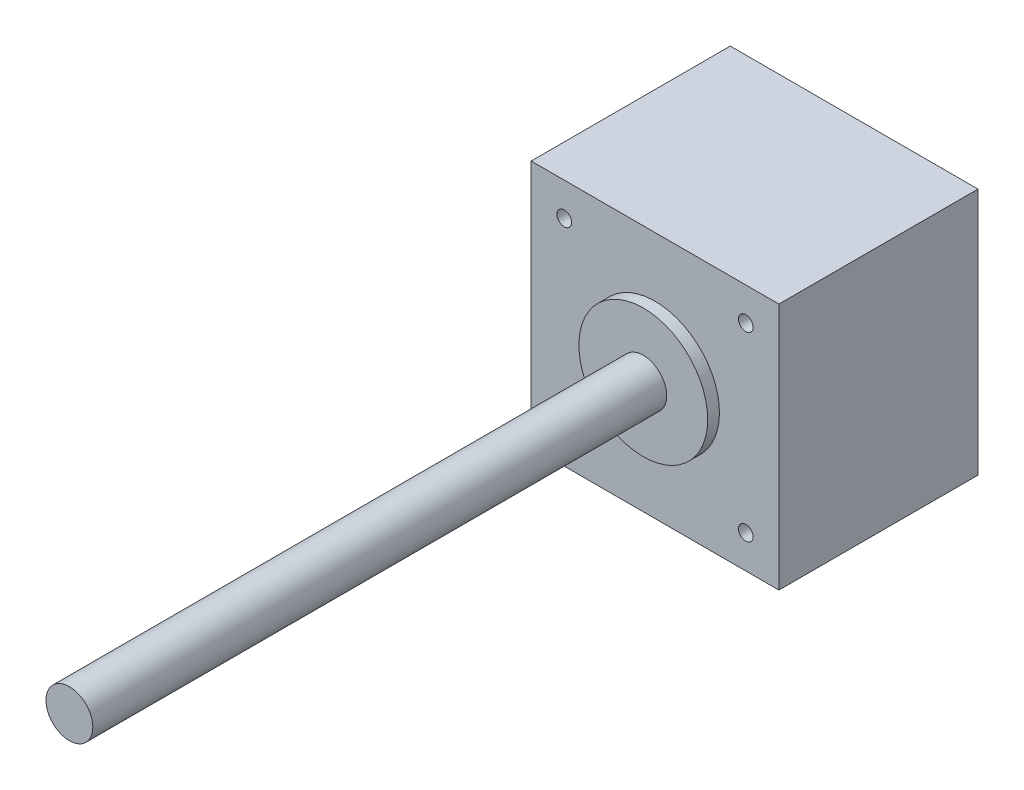
ISO-10303-21;
HEADER;
FILE_DESCRIPTION(('STEP AP214'),'2;1');
FILE_NAME('part.step','',(''),(''),'','','');
FILE_SCHEMA(('AUTOMOTIVE_DESIGN { 1 0 10303 214 1 1 1 1 }'));
ENDSEC;
DATA;
#1=APPLICATION_CONTEXT('core data for automotive mechanical design processes');
#2=APPLICATION_PROTOCOL_DEFINITION('international standard','automotive_design',2000,#1);
#3=PRODUCT_CONTEXT('',#1,'mechanical');
#4=PRODUCT('Part','Part','',(#3));
#5=PRODUCT_RELATED_PRODUCT_CATEGORY('part','',(#4));
#6=PRODUCT_DEFINITION_FORMATION('','',#4);
#7=PRODUCT_DEFINITION_CONTEXT('part definition',#1,'design');
#8=PRODUCT_DEFINITION('design','',#6,#7);
#9=PRODUCT_DEFINITION_SHAPE('','',#8);
#10=(LENGTH_UNIT() NAMED_UNIT(*) SI_UNIT(.MILLI.,.METRE.));
#11=(NAMED_UNIT(*) PLANE_ANGLE_UNIT() SI_UNIT($,.RADIAN.));
#12=(NAMED_UNIT(*) SI_UNIT($,.STERADIAN.) SOLID_ANGLE_UNIT());
#13=UNCERTAINTY_MEASURE_WITH_UNIT(LENGTH_MEASURE(1.E-05),#10,'distance_accuracy_value','');
#14=(GEOMETRIC_REPRESENTATION_CONTEXT(3) GLOBAL_UNCERTAINTY_ASSIGNED_CONTEXT((#13)) GLOBAL_UNIT_ASSIGNED_CONTEXT((#10,
#11,#12)) REPRESENTATION_CONTEXT('',''));
#15=CARTESIAN_POINT('',(0.,0.,0.));
#16=DIRECTION('',(0.,0.,1.));
#17=DIRECTION('',(1.,0.,0.));
#18=AXIS2_PLACEMENT_3D('',#15,#16,#17);
#19=CARTESIAN_POINT('',(-21.15,-21.15,34.));
#20=DIRECTION('',(1.,0.,0.));
#21=DIRECTION('',(0.,0.,-1.));
#22=AXIS2_PLACEMENT_3D('',#19,#20,#21);
#23=PLANE('',#22);
#24=DIRECTION('',(0.,-1.,0.));
#25=VECTOR('',#24,1.);
#26=CARTESIAN_POINT('',(-21.15,-21.15,0.));
#27=LINE('',#26,#25);
#28=CARTESIAN_POINT('',(-21.15,21.15,0.));
#29=VERTEX_POINT('',#28);
#30=CARTESIAN_POINT('',(-21.15,-21.15,0.));
#31=VERTEX_POINT('',#30);
#32=EDGE_CURVE('E117',#29,#31,#27,.T.);
#33=ORIENTED_EDGE('',*,*,#32,.T.);
#34=DIRECTION('',(0.,0.,-1.));
#35=VECTOR('',#34,1.);
#36=CARTESIAN_POINT('',(-21.15,-21.15,34.));
#37=LINE('',#36,#35);
#38=CARTESIAN_POINT('',(-21.15,-21.15,34.));
#39=VERTEX_POINT('',#38);
#40=EDGE_CURVE('E48',#39,#31,#37,.T.);
#41=ORIENTED_EDGE('',*,*,#40,.F.);
#42=DIRECTION('',(0.,-1.,0.));
#43=VECTOR('',#42,1.);
#44=CARTESIAN_POINT('',(-21.15,-21.15,34.));
#45=LINE('',#44,#43);
#46=CARTESIAN_POINT('',(-21.15,21.15,34.));
#47=VERTEX_POINT('',#46);
#48=EDGE_CURVE('E100',#47,#39,#45,.T.);
#49=ORIENTED_EDGE('',*,*,#48,.F.);
#50=DIRECTION('',(0.,0.,-1.));
#51=VECTOR('',#50,1.);
#52=CARTESIAN_POINT('',(-21.15,21.15,34.));
#53=LINE('',#52,#51);
#54=EDGE_CURVE('E113',#47,#29,#53,.T.);
#55=ORIENTED_EDGE('',*,*,#54,.T.);
#56=EDGE_LOOP('',(#33,#41,#49,#55));
#57=FACE_BOUND('',#56,.T.);
#58=ADVANCED_FACE('F45',(#57),#23,.F.);
#59=CARTESIAN_POINT('',(21.15,-21.15,34.));
#60=DIRECTION('',(0.,1.,0.));
#61=DIRECTION('',(-1.,0.,0.));
#62=AXIS2_PLACEMENT_3D('',#59,#60,#61);
#63=PLANE('',#62);
#64=DIRECTION('',(1.,0.,0.));
#65=VECTOR('',#64,1.);
#66=CARTESIAN_POINT('',(21.15,-21.15,0.));
#67=LINE('',#66,#65);
#68=CARTESIAN_POINT('',(21.15,-21.15,0.));
#69=VERTEX_POINT('',#68);
#70=EDGE_CURVE('E106',#31,#69,#67,.T.);
#71=ORIENTED_EDGE('',*,*,#70,.T.);
#72=DIRECTION('',(0.,0.,-1.));
#73=VECTOR('',#72,1.);
#74=CARTESIAN_POINT('',(21.15,-21.15,34.));
#75=LINE('',#74,#73);
#76=CARTESIAN_POINT('',(21.15,-21.15,34.));
#77=VERTEX_POINT('',#76);
#78=EDGE_CURVE('E104',#77,#69,#75,.T.);
#79=ORIENTED_EDGE('',*,*,#78,.F.);
#80=DIRECTION('',(1.,0.,0.));
#81=VECTOR('',#80,1.);
#82=CARTESIAN_POINT('',(21.15,-21.15,34.));
#83=LINE('',#82,#81);
#84=EDGE_CURVE('E95',#39,#77,#83,.T.);
#85=ORIENTED_EDGE('',*,*,#84,.F.);
#86=ORIENTED_EDGE('',*,*,#40,.T.);
#87=EDGE_LOOP('',(#71,#79,#85,#86));
#88=FACE_BOUND('',#87,.T.);
#89=ADVANCED_FACE('F105',(#88),#63,.F.);
#90=CARTESIAN_POINT('',(21.15,-21.15,34.));
#91=DIRECTION('',(-1.,0.,0.));
#92=DIRECTION('',(0.,0.,1.));
#93=AXIS2_PLACEMENT_3D('',#90,#91,#92);
#94=PLANE('',#93);
#95=DIRECTION('',(0.,1.,0.));
#96=VECTOR('',#95,1.);
#97=CARTESIAN_POINT('',(21.15,-21.15,0.));
#98=LINE('',#97,#96);
#99=CARTESIAN_POINT('',(21.15,21.15,0.));
#100=VERTEX_POINT('',#99);
#101=EDGE_CURVE('E81',#69,#100,#98,.T.);
#102=ORIENTED_EDGE('',*,*,#101,.T.);
#103=DIRECTION('',(0.,0.,-1.));
#104=VECTOR('',#103,1.);
#105=CARTESIAN_POINT('',(21.15,21.15,34.));
#106=LINE('',#105,#104);
#107=CARTESIAN_POINT('',(21.15,21.15,34.));
#108=VERTEX_POINT('',#107);
#109=EDGE_CURVE('E108',#108,#100,#106,.T.);
#110=ORIENTED_EDGE('',*,*,#109,.F.);
#111=DIRECTION('',(0.,1.,0.));
#112=VECTOR('',#111,1.);
#113=CARTESIAN_POINT('',(21.15,-21.15,34.));
#114=LINE('',#113,#112);
#115=EDGE_CURVE('E98',#77,#108,#114,.T.);
#116=ORIENTED_EDGE('',*,*,#115,.F.);
#117=ORIENTED_EDGE('',*,*,#78,.T.);
#118=EDGE_LOOP('',(#102,#110,#116,#117));
#119=FACE_BOUND('',#118,.T.);
#120=ADVANCED_FACE('F109',(#119),#94,.F.);
#121=CARTESIAN_POINT('',(21.15,21.15,34.));
#122=DIRECTION('',(0.,-1.,0.));
#123=DIRECTION('',(1.,0.,0.));
#124=AXIS2_PLACEMENT_3D('',#121,#122,#123);
#125=PLANE('',#124);
#126=DIRECTION('',(-1.,0.,0.));
#127=VECTOR('',#126,1.);
#128=CARTESIAN_POINT('',(21.15,21.15,0.));
#129=LINE('',#128,#127);
#130=EDGE_CURVE('E87',#100,#29,#129,.T.);
#131=ORIENTED_EDGE('',*,*,#130,.T.);
#132=ORIENTED_EDGE('',*,*,#54,.F.);
#133=DIRECTION('',(-1.,0.,0.));
#134=VECTOR('',#133,1.);
#135=CARTESIAN_POINT('',(21.15,21.15,34.));
#136=LINE('',#135,#134);
#137=EDGE_CURVE('E64',#108,#47,#136,.T.);
#138=ORIENTED_EDGE('',*,*,#137,.F.);
#139=ORIENTED_EDGE('',*,*,#109,.T.);
#140=EDGE_LOOP('',(#131,#132,#138,#139));
#141=FACE_BOUND('',#140,.T.);
#142=ADVANCED_FACE('F131',(#141),#125,.F.);
#143=CARTESIAN_POINT('',(0.,0.,34.));
#144=DIRECTION('',(0.,0.,1.));
#145=DIRECTION('',(1.,0.,0.));
#146=AXIS2_PLACEMENT_3D('',#143,#144,#145);
#147=PLANE('',#146);
#148=CARTESIAN_POINT('',(-15.5,15.5,34.));
#149=DIRECTION('',(0.,0.,1.));
#150=DIRECTION('',(1.,0.,0.));
#151=AXIS2_PLACEMENT_3D('',#148,#149,#150);
#152=CIRCLE('',#151,1.25);
#153=CARTESIAN_POINT('',(-14.25,15.5,34.));
#154=VERTEX_POINT('',#153);
#155=EDGE_CURVE('E176',#154,#154,#152,.T.);
#156=ORIENTED_EDGE('',*,*,#155,.F.);
#157=EDGE_LOOP('',(#156));
#158=FACE_BOUND('',#157,.T.);
#159=CARTESIAN_POINT('',(15.5,15.5,34.));
#160=DIRECTION('',(0.,0.,1.));
#161=DIRECTION('',(1.,0.,0.));
#162=AXIS2_PLACEMENT_3D('',#159,#160,#161);
#163=CIRCLE('',#162,1.25);
#164=CARTESIAN_POINT('',(16.75,15.5,34.));
#165=VERTEX_POINT('',#164);
#166=EDGE_CURVE('E168',#165,#165,#163,.T.);
#167=ORIENTED_EDGE('',*,*,#166,.F.);
#168=EDGE_LOOP('',(#167));
#169=FACE_BOUND('',#168,.T.);
#170=CARTESIAN_POINT('',(15.5,-15.5,34.));
#171=DIRECTION('',(0.,0.,1.));
#172=DIRECTION('',(1.,0.,0.));
#173=AXIS2_PLACEMENT_3D('',#170,#171,#172);
#174=CIRCLE('',#173,1.25);
#175=CARTESIAN_POINT('',(16.75,-15.5,34.));
#176=VERTEX_POINT('',#175);
#177=EDGE_CURVE('E160',#176,#176,#174,.T.);
#178=ORIENTED_EDGE('',*,*,#177,.F.);
#179=EDGE_LOOP('',(#178));
#180=FACE_BOUND('',#179,.T.);
#181=CARTESIAN_POINT('',(-15.5,-15.5,34.));
#182=DIRECTION('',(0.,0.,1.));
#183=DIRECTION('',(1.,0.,0.));
#184=AXIS2_PLACEMENT_3D('',#181,#182,#183);
#185=CIRCLE('',#184,1.25);
#186=CARTESIAN_POINT('',(-14.25,-15.5,34.));
#187=VERTEX_POINT('',#186);
#188=EDGE_CURVE('E152',#187,#187,#185,.T.);
#189=ORIENTED_EDGE('',*,*,#188,.F.);
#190=EDGE_LOOP('',(#189));
#191=FACE_BOUND('',#190,.T.);
#192=CARTESIAN_POINT('',(0.,0.,34.));
#193=DIRECTION('',(0.,0.,1.));
#194=DIRECTION('',(1.,0.,0.));
#195=AXIS2_PLACEMENT_3D('',#192,#193,#194);
#196=CIRCLE('',#195,11.);
#197=CARTESIAN_POINT('',(11.,0.,34.));
#198=VERTEX_POINT('',#197);
#199=EDGE_CURVE('E55',#198,#198,#196,.T.);
#200=ORIENTED_EDGE('',*,*,#199,.F.);
#201=EDGE_LOOP('',(#200));
#202=FACE_BOUND('',#201,.T.);
#203=ORIENTED_EDGE('',*,*,#48,.T.);
#204=ORIENTED_EDGE('',*,*,#84,.T.);
#205=ORIENTED_EDGE('',*,*,#115,.T.);
#206=ORIENTED_EDGE('',*,*,#137,.T.);
#207=EDGE_LOOP('',(#203,#204,#205,#206));
#208=FACE_BOUND('',#207,.T.);
#209=ADVANCED_FACE('F96',(#158,#169,#180,#191,#202,#208),#147,.T.);
#210=CARTESIAN_POINT('',(0.,0.,0.));
#211=DIRECTION('',(0.,0.,1.));
#212=DIRECTION('',(1.,0.,0.));
#213=AXIS2_PLACEMENT_3D('',#210,#211,#212);
#214=PLANE('',#213);
#215=CARTESIAN_POINT('',(-15.5,15.5,0.));
#216=DIRECTION('',(0.,0.,1.));
#217=DIRECTION('',(1.,0.,0.));
#218=AXIS2_PLACEMENT_3D('',#215,#216,#217);
#219=CIRCLE('',#218,1.24999999999999);
#220=CARTESIAN_POINT('',(-14.25,15.5,0.));
#221=VERTEX_POINT('',#220);
#222=EDGE_CURVE('E172',#221,#221,#219,.T.);
#223=ORIENTED_EDGE('',*,*,#222,.T.);
#224=EDGE_LOOP('',(#223));
#225=FACE_BOUND('',#224,.T.);
#226=CARTESIAN_POINT('',(15.5,15.5,0.));
#227=DIRECTION('',(0.,0.,1.));
#228=DIRECTION('',(1.,0.,0.));
#229=AXIS2_PLACEMENT_3D('',#226,#227,#228);
#230=CIRCLE('',#229,1.24999999999999);
#231=CARTESIAN_POINT('',(16.75,15.5,0.));
#232=VERTEX_POINT('',#231);
#233=EDGE_CURVE('E164',#232,#232,#230,.T.);
#234=ORIENTED_EDGE('',*,*,#233,.T.);
#235=EDGE_LOOP('',(#234));
#236=FACE_BOUND('',#235,.T.);
#237=CARTESIAN_POINT('',(15.5,-15.5,0.));
#238=DIRECTION('',(0.,0.,1.));
#239=DIRECTION('',(1.,0.,0.));
#240=AXIS2_PLACEMENT_3D('',#237,#238,#239);
#241=CIRCLE('',#240,1.24999999999999);
#242=CARTESIAN_POINT('',(16.75,-15.5,0.));
#243=VERTEX_POINT('',#242);
#244=EDGE_CURVE('E156',#243,#243,#241,.T.);
#245=ORIENTED_EDGE('',*,*,#244,.T.);
#246=EDGE_LOOP('',(#245));
#247=FACE_BOUND('',#246,.T.);
#248=CARTESIAN_POINT('',(-15.5,-15.5,0.));
#249=DIRECTION('',(0.,0.,1.));
#250=DIRECTION('',(1.,0.,0.));
#251=AXIS2_PLACEMENT_3D('',#248,#249,#250);
#252=CIRCLE('',#251,1.24999999999999);
#253=CARTESIAN_POINT('',(-14.25,-15.5,0.));
#254=VERTEX_POINT('',#253);
#255=EDGE_CURVE('E148',#254,#254,#252,.T.);
#256=ORIENTED_EDGE('',*,*,#255,.T.);
#257=EDGE_LOOP('',(#256));
#258=FACE_BOUND('',#257,.T.);
#259=ORIENTED_EDGE('',*,*,#32,.F.);
#260=ORIENTED_EDGE('',*,*,#130,.F.);
#261=ORIENTED_EDGE('',*,*,#101,.F.);
#262=ORIENTED_EDGE('',*,*,#70,.F.);
#263=EDGE_LOOP('',(#259,#260,#261,#262));
#264=FACE_BOUND('',#263,.T.);
#265=ADVANCED_FACE('F134',(#225,#236,#247,#258,#264),#214,.F.);
#266=CARTESIAN_POINT('',(0.,0.,36.));
#267=DIRECTION('',(0.,0.,-1.));
#268=DIRECTION('',(-1.,0.,0.));
#269=AXIS2_PLACEMENT_3D('',#266,#267,#268);
#270=CYLINDRICAL_SURFACE('',#269,11.);
#271=CARTESIAN_POINT('',(0.,0.,36.));
#272=DIRECTION('',(0.,0.,1.));
#273=DIRECTION('',(1.,0.,0.));
#274=AXIS2_PLACEMENT_3D('',#271,#272,#273);
#275=CIRCLE('',#274,11.);
#276=CARTESIAN_POINT('',(11.,0.,36.));
#277=VERTEX_POINT('',#276);
#278=EDGE_CURVE('E121',#277,#277,#275,.T.);
#279=ORIENTED_EDGE('',*,*,#278,.F.);
#280=EDGE_LOOP('',(#279));
#281=FACE_BOUND('',#280,.T.);
#282=ORIENTED_EDGE('',*,*,#199,.T.);
#283=EDGE_LOOP('',(#282));
#284=FACE_BOUND('',#283,.T.);
#285=ADVANCED_FACE('F194',(#281,#284),#270,.T.);
#286=CARTESIAN_POINT('',(0.,0.,36.));
#287=DIRECTION('',(0.,0.,1.));
#288=DIRECTION('',(1.,0.,0.));
#289=AXIS2_PLACEMENT_3D('',#286,#287,#288);
#290=PLANE('',#289);
#291=CARTESIAN_POINT('',(0.,0.,36.));
#292=DIRECTION('',(0.,0.,1.));
#293=DIRECTION('',(1.,0.,0.));
#294=AXIS2_PLACEMENT_3D('',#291,#292,#293);
#295=CIRCLE('',#294,4.);
#296=CARTESIAN_POINT('',(4.,0.,36.));
#297=VERTEX_POINT('',#296);
#298=EDGE_CURVE('E11',#297,#297,#295,.T.);
#299=ORIENTED_EDGE('',*,*,#298,.F.);
#300=EDGE_LOOP('',(#299));
#301=FACE_BOUND('',#300,.T.);
#302=ORIENTED_EDGE('',*,*,#278,.T.);
#303=EDGE_LOOP('',(#302));
#304=FACE_BOUND('',#303,.T.);
#305=ADVANCED_FACE('F196',(#301,#304),#290,.T.);
#306=CARTESIAN_POINT('',(0.,0.,134.));
#307=DIRECTION('',(0.,0.,-1.));
#308=DIRECTION('',(-1.,0.,0.));
#309=AXIS2_PLACEMENT_3D('',#306,#307,#308);
#310=CYLINDRICAL_SURFACE('',#309,4.);
#311=CARTESIAN_POINT('',(0.,0.,134.));
#312=DIRECTION('',(0.,0.,1.));
#313=DIRECTION('',(1.,0.,0.));
#314=AXIS2_PLACEMENT_3D('',#311,#312,#313);
#315=CIRCLE('',#314,4.);
#316=CARTESIAN_POINT('',(4.,0.,134.));
#317=VERTEX_POINT('',#316);
#318=EDGE_CURVE('E143',#317,#317,#315,.T.);
#319=ORIENTED_EDGE('',*,*,#318,.F.);
#320=EDGE_LOOP('',(#319));
#321=FACE_BOUND('',#320,.T.);
#322=ORIENTED_EDGE('',*,*,#298,.T.);
#323=EDGE_LOOP('',(#322));
#324=FACE_BOUND('',#323,.T.);
#325=ADVANCED_FACE('F203',(#321,#324),#310,.T.);
#326=CARTESIAN_POINT('',(0.,0.,134.));
#327=DIRECTION('',(0.,0.,1.));
#328=DIRECTION('',(1.,0.,0.));
#329=AXIS2_PLACEMENT_3D('',#326,#327,#328);
#330=PLANE('',#329);
#331=ORIENTED_EDGE('',*,*,#318,.T.);
#332=EDGE_LOOP('',(#331));
#333=FACE_BOUND('',#332,.T.);
#334=ADVANCED_FACE('F246',(#333),#330,.T.);
#335=CARTESIAN_POINT('',(-15.5,-15.5,34.));
#336=DIRECTION('',(0.,0.,1.));
#337=DIRECTION('',(1.,0.,0.));
#338=AXIS2_PLACEMENT_3D('',#335,#336,#337);
#339=CYLINDRICAL_SURFACE('',#338,1.25);
#340=ORIENTED_EDGE('',*,*,#255,.F.);
#341=EDGE_LOOP('',(#340));
#342=FACE_BOUND('',#341,.T.);
#343=ORIENTED_EDGE('',*,*,#188,.T.);
#344=EDGE_LOOP('',(#343));
#345=FACE_BOUND('',#344,.T.);
#346=ADVANCED_FACE('F239',(#342,#345),#339,.F.);
#347=CARTESIAN_POINT('',(15.5,-15.5,34.));
#348=DIRECTION('',(0.,0.,1.));
#349=DIRECTION('',(1.,0.,0.));
#350=AXIS2_PLACEMENT_3D('',#347,#348,#349);
#351=CYLINDRICAL_SURFACE('',#350,1.25);
#352=ORIENTED_EDGE('',*,*,#244,.F.);
#353=EDGE_LOOP('',(#352));
#354=FACE_BOUND('',#353,.T.);
#355=ORIENTED_EDGE('',*,*,#177,.T.);
#356=EDGE_LOOP('',(#355));
#357=FACE_BOUND('',#356,.T.);
#358=ADVANCED_FACE('F245',(#354,#357),#351,.F.);
#359=CARTESIAN_POINT('',(15.5,15.5,34.));
#360=DIRECTION('',(0.,0.,1.));
#361=DIRECTION('',(1.,0.,0.));
#362=AXIS2_PLACEMENT_3D('',#359,#360,#361);
#363=CYLINDRICAL_SURFACE('',#362,1.24999999999999);
#364=ORIENTED_EDGE('',*,*,#233,.F.);
#365=EDGE_LOOP('',(#364));
#366=FACE_BOUND('',#365,.T.);
#367=ORIENTED_EDGE('',*,*,#166,.T.);
#368=EDGE_LOOP('',(#367));
#369=FACE_BOUND('',#368,.T.);
#370=ADVANCED_FACE('F259',(#366,#369),#363,.F.);
#371=CARTESIAN_POINT('',(-15.5,15.5,34.));
#372=DIRECTION('',(0.,0.,1.));
#373=DIRECTION('',(1.,0.,0.));
#374=AXIS2_PLACEMENT_3D('',#371,#372,#373);
#375=CYLINDRICAL_SURFACE('',#374,1.25);
#376=ORIENTED_EDGE('',*,*,#222,.F.);
#377=EDGE_LOOP('',(#376));
#378=FACE_BOUND('',#377,.T.);
#379=ORIENTED_EDGE('',*,*,#155,.T.);
#380=EDGE_LOOP('',(#379));
#381=FACE_BOUND('',#380,.T.);
#382=ADVANCED_FACE('F181',(#378,#381),#375,.F.);
#383=CLOSED_SHELL('',(#58,#89,#120,#142,#209,#265,#285,#305,#325,#334,#346,#358,#370,#382));
#384=MANIFOLD_SOLID_BREP('B2',#383);
#385=ADVANCED_BREP_SHAPE_REPRESENTATION('',(#18,#384),#14);
#386=SHAPE_DEFINITION_REPRESENTATION(#9,#385);
ENDSEC;
END-ISO-10303-21;
